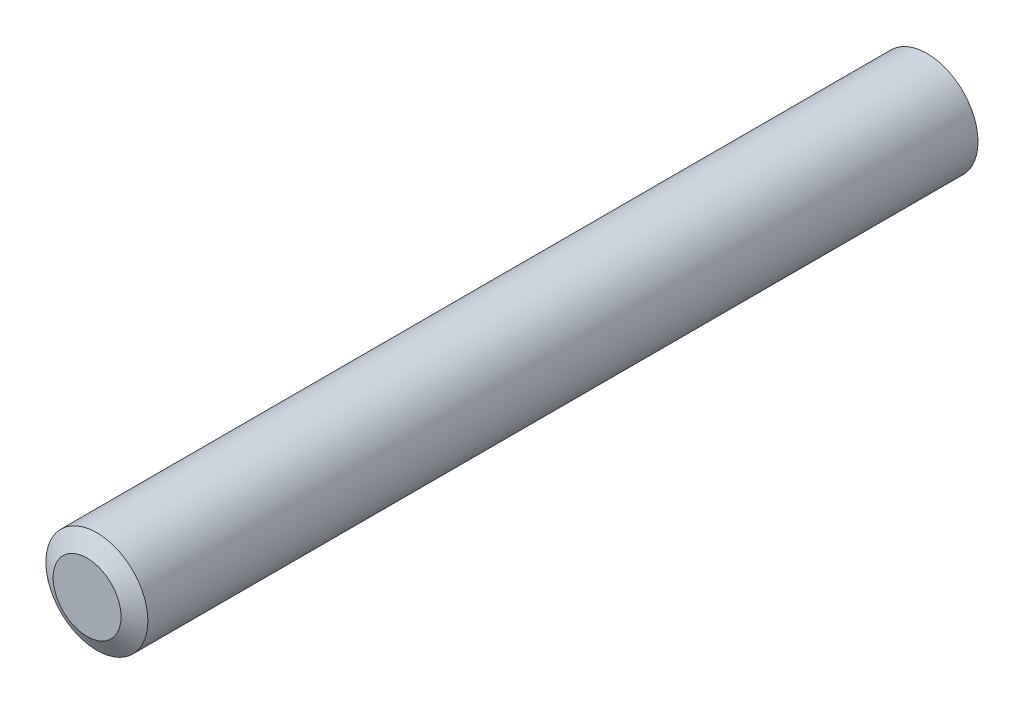
ISO-10303-21;
HEADER;
FILE_DESCRIPTION(('STEP AP214'),'2;1');
FILE_NAME('part.step','',(''),(''),'','','');
FILE_SCHEMA(('AUTOMOTIVE_DESIGN { 1 0 10303 214 1 1 1 1 }'));
ENDSEC;
DATA;
#1=APPLICATION_CONTEXT('core data for automotive mechanical design processes');
#2=APPLICATION_PROTOCOL_DEFINITION('international standard','automotive_design',2000,#1);
#3=PRODUCT_CONTEXT('',#1,'mechanical');
#4=PRODUCT('Part','Part','',(#3));
#5=PRODUCT_RELATED_PRODUCT_CATEGORY('part','',(#4));
#6=PRODUCT_DEFINITION_FORMATION('','',#4);
#7=PRODUCT_DEFINITION_CONTEXT('part definition',#1,'design');
#8=PRODUCT_DEFINITION('design','',#6,#7);
#9=PRODUCT_DEFINITION_SHAPE('','',#8);
#10=(LENGTH_UNIT() NAMED_UNIT(*) SI_UNIT(.MILLI.,.METRE.));
#11=(NAMED_UNIT(*) PLANE_ANGLE_UNIT() SI_UNIT($,.RADIAN.));
#12=(NAMED_UNIT(*) SI_UNIT($,.STERADIAN.) SOLID_ANGLE_UNIT());
#13=UNCERTAINTY_MEASURE_WITH_UNIT(LENGTH_MEASURE(1.E-05),#10,'distance_accuracy_value','');
#14=(GEOMETRIC_REPRESENTATION_CONTEXT(3) GLOBAL_UNCERTAINTY_ASSIGNED_CONTEXT((#13)) GLOBAL_UNIT_ASSIGNED_CONTEXT((#10,
#11,#12)) REPRESENTATION_CONTEXT('',''));
#15=CARTESIAN_POINT('',(0.,0.,0.));
#16=DIRECTION('',(0.,0.,1.));
#17=DIRECTION('',(1.,0.,0.));
#18=AXIS2_PLACEMENT_3D('',#15,#16,#17);
#19=CARTESIAN_POINT('',(-85.9424945589406,-31.1,-25.));
#20=DIRECTION('',(0.,0.,1.));
#21=DIRECTION('',(1.,0.,0.));
#22=AXIS2_PLACEMENT_3D('',#19,#20,#21);
#23=CYLINDRICAL_SURFACE('',#22,1.49999999999998);
#24=CARTESIAN_POINT('',(-85.9424945589406,-31.1,-0.288675134594817));
#25=DIRECTION('',(0.,0.,1.));
#26=DIRECTION('',(1.,0.,0.));
#27=AXIS2_PLACEMENT_3D('',#24,#25,#26);
#28=CIRCLE('',#27,1.49999999999998);
#29=CARTESIAN_POINT('',(-84.4424945589406,-31.1,-0.288675134594817));
#30=VERTEX_POINT('',#29);
#31=EDGE_CURVE('E38',#30,#30,#28,.F.);
#32=ORIENTED_EDGE('',*,*,#31,.T.);
#33=EDGE_LOOP('',(#32));
#34=FACE_BOUND('',#33,.T.);
#35=CARTESIAN_POINT('',(-85.9424945589406,-31.1,-24.7113248654052));
#36=DIRECTION('',(0.,0.,1.));
#37=DIRECTION('',(1.,0.,0.));
#38=AXIS2_PLACEMENT_3D('',#35,#36,#37);
#39=CIRCLE('',#38,1.49999999999998);
#40=CARTESIAN_POINT('',(-84.4424945589406,-31.1,-24.7113248654052));
#41=VERTEX_POINT('',#40);
#42=EDGE_CURVE('E42',#41,#41,#39,.T.);
#43=ORIENTED_EDGE('',*,*,#42,.T.);
#44=EDGE_LOOP('',(#43));
#45=FACE_BOUND('',#44,.T.);
#46=ADVANCED_FACE('F32',(#34,#45),#23,.T.);
#47=CARTESIAN_POINT('',(-85.9424945589406,-31.1,-25.));
#48=DIRECTION('',(0.,0.,1.));
#49=DIRECTION('',(1.,0.,0.));
#50=AXIS2_PLACEMENT_3D('',#47,#48,#49);
#51=PLANE('',#50);
#52=CARTESIAN_POINT('',(-85.9424945589406,-31.1,-25.));
#53=DIRECTION('',(0.,0.,1.));
#54=DIRECTION('',(1.,0.,0.));
#55=AXIS2_PLACEMENT_3D('',#52,#53,#54);
#56=CIRCLE('',#55,0.999999999999987);
#57=CARTESIAN_POINT('',(-84.9424945589406,-31.1,-25.));
#58=VERTEX_POINT('',#57);
#59=EDGE_CURVE('E10',#58,#58,#56,.F.);
#60=ORIENTED_EDGE('',*,*,#59,.T.);
#61=EDGE_LOOP('',(#60));
#62=FACE_BOUND('',#61,.T.);
#63=ADVANCED_FACE('F65',(#62),#51,.F.);
#64=CARTESIAN_POINT('',(-85.9424945589406,-31.1,0.));
#65=DIRECTION('',(0.,0.,1.));
#66=DIRECTION('',(1.,0.,0.));
#67=AXIS2_PLACEMENT_3D('',#64,#65,#66);
#68=PLANE('',#67);
#69=CARTESIAN_POINT('',(-85.9424945589406,-31.1,0.));
#70=DIRECTION('',(0.,0.,1.));
#71=DIRECTION('',(1.,0.,0.));
#72=AXIS2_PLACEMENT_3D('',#69,#70,#71);
#73=CIRCLE('',#72,0.999999999999987);
#74=CARTESIAN_POINT('',(-84.9424945589406,-31.1,0.));
#75=VERTEX_POINT('',#74);
#76=EDGE_CURVE('E46',#75,#75,#73,.T.);
#77=ORIENTED_EDGE('',*,*,#76,.T.);
#78=EDGE_LOOP('',(#77));
#79=FACE_BOUND('',#78,.T.);
#80=ADVANCED_FACE('F52',(#79),#68,.T.);
#81=CARTESIAN_POINT('',(-85.9424945589406,-31.1,0.));
#82=DIRECTION('',(0.,0.,-1.));
#83=DIRECTION('',(-1.,0.,0.));
#84=AXIS2_PLACEMENT_3D('',#81,#82,#83);
#85=CONICAL_SURFACE('',#84,0.999999999999987,1.04719755119659);
#86=ORIENTED_EDGE('',*,*,#31,.F.);
#87=EDGE_LOOP('',(#86));
#88=FACE_BOUND('',#87,.T.);
#89=ORIENTED_EDGE('',*,*,#76,.F.);
#90=EDGE_LOOP('',(#89));
#91=FACE_BOUND('',#90,.T.);
#92=ADVANCED_FACE('F54',(#88,#91),#85,.T.);
#93=CARTESIAN_POINT('',(-85.9424945589406,-31.1,-24.7113248654052));
#94=DIRECTION('',(0.,0.,1.));
#95=DIRECTION('',(1.,0.,0.));
#96=AXIS2_PLACEMENT_3D('',#93,#94,#95);
#97=CONICAL_SURFACE('',#96,1.49999999999998,1.04719755119659);
#98=ORIENTED_EDGE('',*,*,#59,.F.);
#99=EDGE_LOOP('',(#98));
#100=FACE_BOUND('',#99,.T.);
#101=ORIENTED_EDGE('',*,*,#42,.F.);
#102=EDGE_LOOP('',(#101));
#103=FACE_BOUND('',#102,.T.);
#104=ADVANCED_FACE('F56',(#100,#103),#97,.T.);
#105=CLOSED_SHELL('',(#46,#63,#80,#92,#104));
#106=MANIFOLD_SOLID_BREP('B2',#105);
#107=ADVANCED_BREP_SHAPE_REPRESENTATION('',(#18,#106),#14);
#108=SHAPE_DEFINITION_REPRESENTATION(#9,#107);
ENDSEC;
END-ISO-10303-21;
